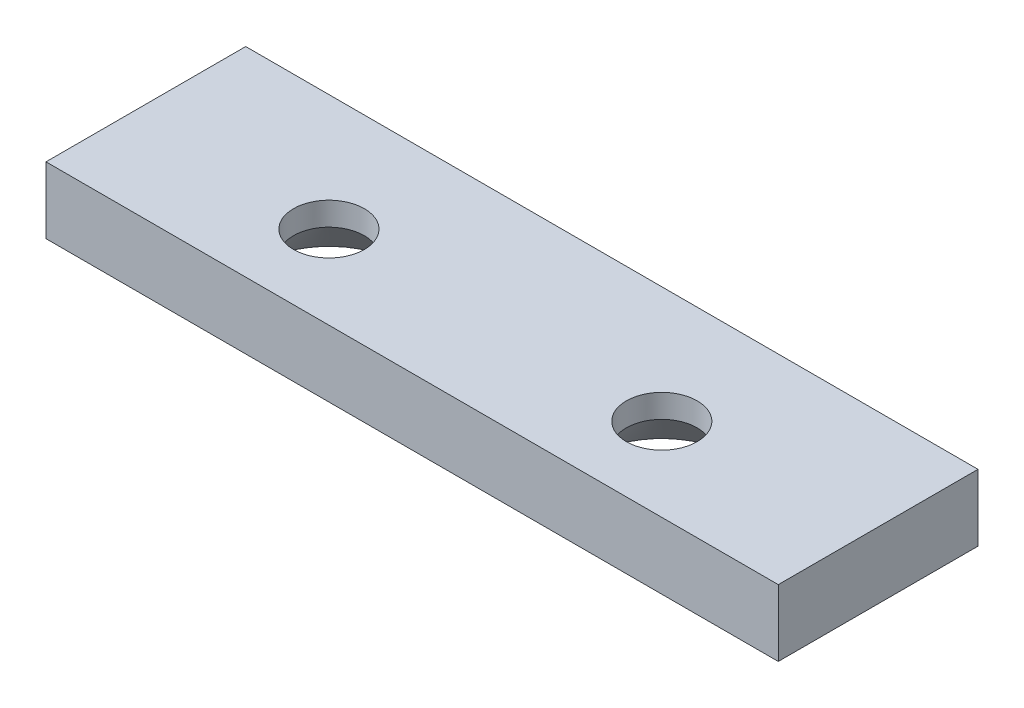
ISO-10303-21;
HEADER;
FILE_DESCRIPTION(('STEP AP214'),'2;1');
FILE_NAME('part.step','',(''),(''),'','','');
FILE_SCHEMA(('AUTOMOTIVE_DESIGN { 1 0 10303 214 1 1 1 1 }'));
ENDSEC;
DATA;
#1=APPLICATION_CONTEXT('core data for automotive mechanical design processes');
#2=APPLICATION_PROTOCOL_DEFINITION('international standard','automotive_design',2000,#1);
#3=PRODUCT_CONTEXT('',#1,'mechanical');
#4=PRODUCT('Part','Part','',(#3));
#5=PRODUCT_RELATED_PRODUCT_CATEGORY('part','',(#4));
#6=PRODUCT_DEFINITION_FORMATION('','',#4);
#7=PRODUCT_DEFINITION_CONTEXT('part definition',#1,'design');
#8=PRODUCT_DEFINITION('design','',#6,#7);
#9=PRODUCT_DEFINITION_SHAPE('','',#8);
#10=(LENGTH_UNIT() NAMED_UNIT(*) SI_UNIT(.MILLI.,.METRE.));
#11=(NAMED_UNIT(*) PLANE_ANGLE_UNIT() SI_UNIT($,.RADIAN.));
#12=(NAMED_UNIT(*) SI_UNIT($,.STERADIAN.) SOLID_ANGLE_UNIT());
#13=UNCERTAINTY_MEASURE_WITH_UNIT(LENGTH_MEASURE(1.E-05),#10,'distance_accuracy_value','');
#14=(GEOMETRIC_REPRESENTATION_CONTEXT(3) GLOBAL_UNCERTAINTY_ASSIGNED_CONTEXT((#13)) GLOBAL_UNIT_ASSIGNED_CONTEXT((#10,
#11,#12)) REPRESENTATION_CONTEXT('',''));
#15=CARTESIAN_POINT('',(0.,0.,0.));
#16=DIRECTION('',(0.,0.,1.));
#17=DIRECTION('',(1.,0.,0.));
#18=AXIS2_PLACEMENT_3D('',#15,#16,#17);
#19=CARTESIAN_POINT('',(-34.925,6.35,9.52500000000001));
#20=DIRECTION('',(1.,0.,0.));
#21=DIRECTION('',(0.,0.,-1.));
#22=AXIS2_PLACEMENT_3D('',#19,#20,#21);
#23=PLANE('',#22);
#24=DIRECTION('',(0.,0.,1.));
#25=VECTOR('',#24,1.);
#26=CARTESIAN_POINT('',(-34.925,0.,9.52500000000001));
#27=LINE('',#26,#25);
#28=CARTESIAN_POINT('',(-34.925,0.,-9.525));
#29=VERTEX_POINT('',#28);
#30=CARTESIAN_POINT('',(-34.925,0.,9.52500000000001));
#31=VERTEX_POINT('',#30);
#32=EDGE_CURVE('E100',#29,#31,#27,.T.);
#33=ORIENTED_EDGE('',*,*,#32,.T.);
#34=DIRECTION('',(0.,-1.,0.));
#35=VECTOR('',#34,1.);
#36=CARTESIAN_POINT('',(-34.925,6.35,9.52500000000001));
#37=LINE('',#36,#35);
#38=CARTESIAN_POINT('',(-34.925,6.35,9.52500000000001));
#39=VERTEX_POINT('',#38);
#40=EDGE_CURVE('E11',#39,#31,#37,.T.);
#41=ORIENTED_EDGE('',*,*,#40,.F.);
#42=DIRECTION('',(0.,0.,1.));
#43=VECTOR('',#42,1.);
#44=CARTESIAN_POINT('',(-34.925,6.35,9.52500000000001));
#45=LINE('',#44,#43);
#46=CARTESIAN_POINT('',(-34.925,6.35,-9.525));
#47=VERTEX_POINT('',#46);
#48=EDGE_CURVE('E87',#47,#39,#45,.T.);
#49=ORIENTED_EDGE('',*,*,#48,.F.);
#50=DIRECTION('',(0.,-1.,0.));
#51=VECTOR('',#50,1.);
#52=CARTESIAN_POINT('',(-34.925,6.35,-9.525));
#53=LINE('',#52,#51);
#54=EDGE_CURVE('E96',#47,#29,#53,.T.);
#55=ORIENTED_EDGE('',*,*,#54,.T.);
#56=EDGE_LOOP('',(#33,#41,#49,#55));
#57=FACE_BOUND('',#56,.T.);
#58=ADVANCED_FACE('F34',(#57),#23,.F.);
#59=CARTESIAN_POINT('',(34.925,6.35,9.525));
#60=DIRECTION('',(0.,0.,-1.));
#61=DIRECTION('',(-1.,0.,0.));
#62=AXIS2_PLACEMENT_3D('',#59,#60,#61);
#63=PLANE('',#62);
#64=DIRECTION('',(1.,0.,0.));
#65=VECTOR('',#64,1.);
#66=CARTESIAN_POINT('',(34.925,0.,9.525));
#67=LINE('',#66,#65);
#68=CARTESIAN_POINT('',(34.925,0.,9.525));
#69=VERTEX_POINT('',#68);
#70=EDGE_CURVE('E91',#31,#69,#67,.T.);
#71=ORIENTED_EDGE('',*,*,#70,.T.);
#72=DIRECTION('',(0.,-1.,0.));
#73=VECTOR('',#72,1.);
#74=CARTESIAN_POINT('',(34.925,6.35,9.525));
#75=LINE('',#74,#73);
#76=CARTESIAN_POINT('',(34.925,6.35,9.525));
#77=VERTEX_POINT('',#76);
#78=EDGE_CURVE('E43',#77,#69,#75,.T.);
#79=ORIENTED_EDGE('',*,*,#78,.F.);
#80=DIRECTION('',(1.,0.,0.));
#81=VECTOR('',#80,1.);
#82=CARTESIAN_POINT('',(34.925,6.35,9.525));
#83=LINE('',#82,#81);
#84=EDGE_CURVE('E82',#39,#77,#83,.T.);
#85=ORIENTED_EDGE('',*,*,#84,.F.);
#86=ORIENTED_EDGE('',*,*,#40,.T.);
#87=EDGE_LOOP('',(#71,#79,#85,#86));
#88=FACE_BOUND('',#87,.T.);
#89=ADVANCED_FACE('F90',(#88),#63,.F.);
#90=CARTESIAN_POINT('',(34.925,6.35,9.525));
#91=DIRECTION('',(-1.,0.,0.));
#92=DIRECTION('',(0.,0.,1.));
#93=AXIS2_PLACEMENT_3D('',#90,#91,#92);
#94=PLANE('',#93);
#95=DIRECTION('',(0.,0.,-1.));
#96=VECTOR('',#95,1.);
#97=CARTESIAN_POINT('',(34.925,0.,9.525));
#98=LINE('',#97,#96);
#99=CARTESIAN_POINT('',(34.925,0.,-9.525));
#100=VERTEX_POINT('',#99);
#101=EDGE_CURVE('E69',#69,#100,#98,.T.);
#102=ORIENTED_EDGE('',*,*,#101,.T.);
#103=DIRECTION('',(0.,-1.,0.));
#104=VECTOR('',#103,1.);
#105=CARTESIAN_POINT('',(34.925,6.35,-9.525));
#106=LINE('',#105,#104);
#107=CARTESIAN_POINT('',(34.925,6.35,-9.525));
#108=VERTEX_POINT('',#107);
#109=EDGE_CURVE('E92',#108,#100,#106,.T.);
#110=ORIENTED_EDGE('',*,*,#109,.F.);
#111=DIRECTION('',(0.,0.,-1.));
#112=VECTOR('',#111,1.);
#113=CARTESIAN_POINT('',(34.925,6.35,9.525));
#114=LINE('',#113,#112);
#115=EDGE_CURVE('E85',#77,#108,#114,.T.);
#116=ORIENTED_EDGE('',*,*,#115,.F.);
#117=ORIENTED_EDGE('',*,*,#78,.T.);
#118=EDGE_LOOP('',(#102,#110,#116,#117));
#119=FACE_BOUND('',#118,.T.);
#120=ADVANCED_FACE('F94',(#119),#94,.F.);
#121=CARTESIAN_POINT('',(34.925,6.35,-9.525));
#122=DIRECTION('',(0.,0.,1.));
#123=DIRECTION('',(1.,0.,0.));
#124=AXIS2_PLACEMENT_3D('',#121,#122,#123);
#125=PLANE('',#124);
#126=DIRECTION('',(-1.,0.,0.));
#127=VECTOR('',#126,1.);
#128=CARTESIAN_POINT('',(34.925,0.,-9.525));
#129=LINE('',#128,#127);
#130=EDGE_CURVE('E75',#100,#29,#129,.T.);
#131=ORIENTED_EDGE('',*,*,#130,.T.);
#132=ORIENTED_EDGE('',*,*,#54,.F.);
#133=DIRECTION('',(-1.,0.,0.));
#134=VECTOR('',#133,1.);
#135=CARTESIAN_POINT('',(34.925,6.35,-9.525));
#136=LINE('',#135,#134);
#137=EDGE_CURVE('E52',#108,#47,#136,.T.);
#138=ORIENTED_EDGE('',*,*,#137,.F.);
#139=ORIENTED_EDGE('',*,*,#109,.T.);
#140=EDGE_LOOP('',(#131,#132,#138,#139));
#141=FACE_BOUND('',#140,.T.);
#142=ADVANCED_FACE('F138',(#141),#125,.F.);
#143=CARTESIAN_POINT('',(0.,6.35,0.));
#144=DIRECTION('',(0.,1.,0.));
#145=DIRECTION('',(0.,0.,1.));
#146=AXIS2_PLACEMENT_3D('',#143,#144,#145);
#147=PLANE('',#146);
#148=CARTESIAN_POINT('',(-15.875,6.35,1.58750000000001));
#149=DIRECTION('',(0.,1.,0.));
#150=DIRECTION('',(0.,0.,1.));
#151=AXIS2_PLACEMENT_3D('',#148,#149,#150);
#152=CIRCLE('',#151,3.3782);
#153=CARTESIAN_POINT('',(-15.875,6.35,4.9657));
#154=VERTEX_POINT('',#153);
#155=EDGE_CURVE('E37',#154,#154,#152,.T.);
#156=ORIENTED_EDGE('',*,*,#155,.F.);
#157=EDGE_LOOP('',(#156));
#158=FACE_BOUND('',#157,.T.);
#159=CARTESIAN_POINT('',(15.875,6.35,1.58750000000001));
#160=DIRECTION('',(0.,1.,0.));
#161=DIRECTION('',(0.,0.,1.));
#162=AXIS2_PLACEMENT_3D('',#159,#160,#161);
#163=CIRCLE('',#162,3.3782);
#164=CARTESIAN_POINT('',(15.875,6.35,4.9657));
#165=VERTEX_POINT('',#164);
#166=EDGE_CURVE('E103',#165,#165,#163,.T.);
#167=ORIENTED_EDGE('',*,*,#166,.F.);
#168=EDGE_LOOP('',(#167));
#169=FACE_BOUND('',#168,.T.);
#170=ORIENTED_EDGE('',*,*,#48,.T.);
#171=ORIENTED_EDGE('',*,*,#84,.T.);
#172=ORIENTED_EDGE('',*,*,#115,.T.);
#173=ORIENTED_EDGE('',*,*,#137,.T.);
#174=EDGE_LOOP('',(#170,#171,#172,#173));
#175=FACE_BOUND('',#174,.T.);
#176=ADVANCED_FACE('F83',(#158,#169,#175),#147,.T.);
#177=CARTESIAN_POINT('',(0.,0.,0.));
#178=DIRECTION('',(0.,1.,0.));
#179=DIRECTION('',(0.,0.,1.));
#180=AXIS2_PLACEMENT_3D('',#177,#178,#179);
#181=PLANE('',#180);
#182=CARTESIAN_POINT('',(-15.875,0.,1.58750000000001));
#183=DIRECTION('',(0.,-1.,0.));
#184=DIRECTION('',(0.,0.,-1.));
#185=AXIS2_PLACEMENT_3D('',#182,#183,#184);
#186=CIRCLE('',#185,6.9596);
#187=CARTESIAN_POINT('',(-15.875,0.,-5.37209999999999));
#188=VERTEX_POINT('',#187);
#189=EDGE_CURVE('E123',#188,#188,#186,.T.);
#190=ORIENTED_EDGE('',*,*,#189,.F.);
#191=EDGE_LOOP('',(#190));
#192=FACE_BOUND('',#191,.T.);
#193=CARTESIAN_POINT('',(15.875,0.,1.58750000000001));
#194=DIRECTION('',(0.,-1.,0.));
#195=DIRECTION('',(0.,0.,-1.));
#196=AXIS2_PLACEMENT_3D('',#193,#194,#195);
#197=CIRCLE('',#196,6.9596);
#198=CARTESIAN_POINT('',(15.875,0.,-5.37209999999999));
#199=VERTEX_POINT('',#198);
#200=EDGE_CURVE('E113',#199,#199,#197,.T.);
#201=ORIENTED_EDGE('',*,*,#200,.F.);
#202=EDGE_LOOP('',(#201));
#203=FACE_BOUND('',#202,.T.);
#204=ORIENTED_EDGE('',*,*,#32,.F.);
#205=ORIENTED_EDGE('',*,*,#130,.F.);
#206=ORIENTED_EDGE('',*,*,#101,.F.);
#207=ORIENTED_EDGE('',*,*,#70,.F.);
#208=EDGE_LOOP('',(#204,#205,#206,#207));
#209=FACE_BOUND('',#208,.T.);
#210=ADVANCED_FACE('F129',(#192,#203,#209),#181,.F.);
#211=CARTESIAN_POINT('',(15.875,0.,1.58750000000001));
#212=DIRECTION('',(0.,-1.,0.));
#213=DIRECTION('',(0.,0.,-1.));
#214=AXIS2_PLACEMENT_3D('',#211,#212,#213);
#215=CYLINDRICAL_SURFACE('',#214,3.3782);
#216=ORIENTED_EDGE('',*,*,#166,.T.);
#217=EDGE_LOOP('',(#216));
#218=FACE_BOUND('',#217,.T.);
#219=CARTESIAN_POINT('',(15.875,4.11992941362132,1.58750000000001));
#220=DIRECTION('',(0.,-1.,0.));
#221=DIRECTION('',(0.,0.,-1.));
#222=AXIS2_PLACEMENT_3D('',#219,#220,#221);
#223=CIRCLE('',#222,3.3782);
#224=CARTESIAN_POINT('',(15.875,4.11992941362132,-1.79069999999999));
#225=VERTEX_POINT('',#224);
#226=EDGE_CURVE('E109',#225,#225,#223,.T.);
#227=ORIENTED_EDGE('',*,*,#226,.T.);
#228=EDGE_LOOP('',(#227));
#229=FACE_BOUND('',#228,.T.);
#230=ADVANCED_FACE('F132',(#218,#229),#215,.F.);
#231=CARTESIAN_POINT('',(15.875,0.,1.58750000000001));
#232=DIRECTION('',(0.,-1.,0.));
#233=DIRECTION('',(0.,0.,-1.));
#234=AXIS2_PLACEMENT_3D('',#231,#232,#233);
#235=CONICAL_SURFACE('',#234,6.9596,0.715584993317676);
#236=ORIENTED_EDGE('',*,*,#226,.F.);
#237=EDGE_LOOP('',(#236));
#238=FACE_BOUND('',#237,.T.);
#239=ORIENTED_EDGE('',*,*,#200,.T.);
#240=EDGE_LOOP('',(#239));
#241=FACE_BOUND('',#240,.T.);
#242=ADVANCED_FACE('F183',(#238,#241),#235,.F.);
#243=CARTESIAN_POINT('',(-15.875,0.,1.58750000000001));
#244=DIRECTION('',(0.,-1.,0.));
#245=DIRECTION('',(0.,0.,-1.));
#246=AXIS2_PLACEMENT_3D('',#243,#244,#245);
#247=CYLINDRICAL_SURFACE('',#246,3.3782);
#248=ORIENTED_EDGE('',*,*,#155,.T.);
#249=EDGE_LOOP('',(#248));
#250=FACE_BOUND('',#249,.T.);
#251=CARTESIAN_POINT('',(-15.875,4.11992941362132,1.58750000000001));
#252=DIRECTION('',(0.,-1.,0.));
#253=DIRECTION('',(0.,0.,-1.));
#254=AXIS2_PLACEMENT_3D('',#251,#252,#253);
#255=CIRCLE('',#254,3.3782);
#256=CARTESIAN_POINT('',(-15.875,4.11992941362132,-1.79069999999999));
#257=VERTEX_POINT('',#256);
#258=EDGE_CURVE('E120',#257,#257,#255,.T.);
#259=ORIENTED_EDGE('',*,*,#258,.T.);
#260=EDGE_LOOP('',(#259));
#261=FACE_BOUND('',#260,.T.);
#262=ADVANCED_FACE('F193',(#250,#261),#247,.F.);
#263=CARTESIAN_POINT('',(-15.875,0.,1.58750000000001));
#264=DIRECTION('',(0.,-1.,0.));
#265=DIRECTION('',(0.,0.,-1.));
#266=AXIS2_PLACEMENT_3D('',#263,#264,#265);
#267=CONICAL_SURFACE('',#266,6.9596,0.715584993317676);
#268=ORIENTED_EDGE('',*,*,#258,.F.);
#269=EDGE_LOOP('',(#268));
#270=FACE_BOUND('',#269,.T.);
#271=ORIENTED_EDGE('',*,*,#189,.T.);
#272=EDGE_LOOP('',(#271));
#273=FACE_BOUND('',#272,.T.);
#274=ADVANCED_FACE('F127',(#270,#273),#267,.F.);
#275=CLOSED_SHELL('',(#58,#89,#120,#142,#176,#210,#230,#242,#262,#274));
#276=MANIFOLD_SOLID_BREP('B2',#275);
#277=ADVANCED_BREP_SHAPE_REPRESENTATION('',(#18,#276),#14);
#278=SHAPE_DEFINITION_REPRESENTATION(#9,#277);
ENDSEC;
END-ISO-10303-21;
